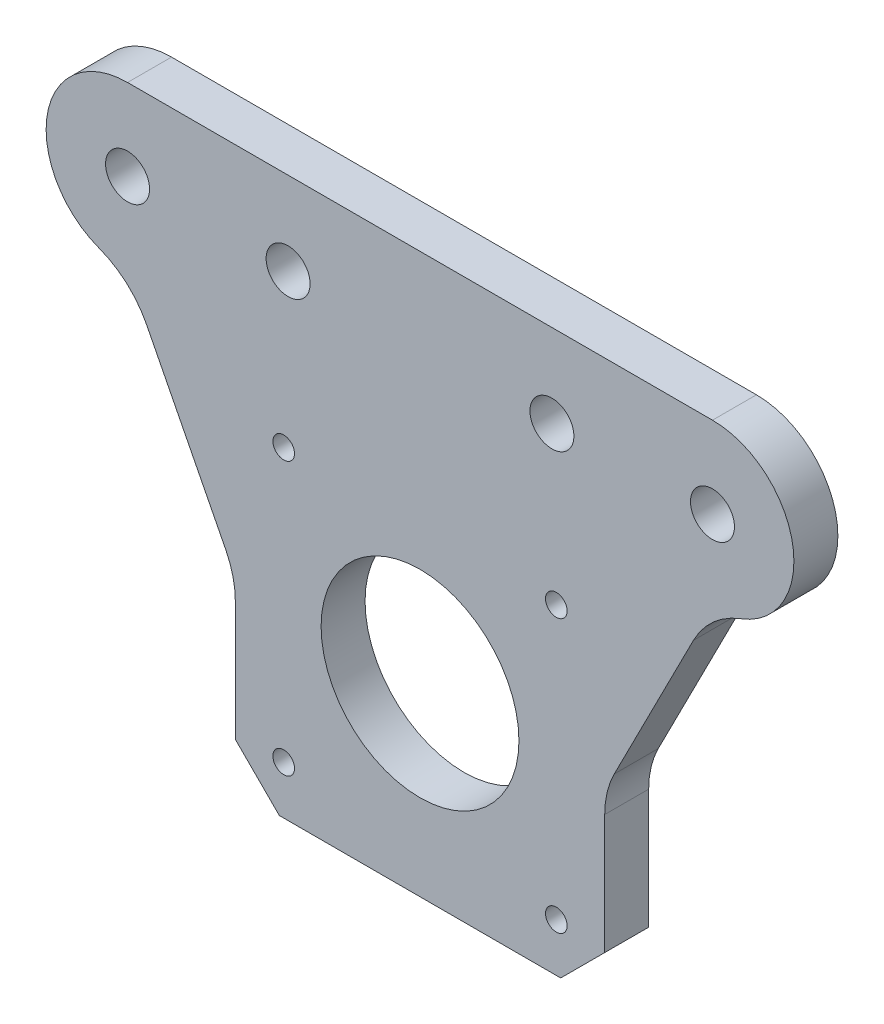
ISO-10303-21;
HEADER;
FILE_DESCRIPTION(('STEP AP214'),'2;1');
FILE_NAME('part.step','',(''),(''),'','','');
FILE_SCHEMA(('AUTOMOTIVE_DESIGN { 1 0 10303 214 1 1 1 1 }'));
ENDSEC;
DATA;
#1=APPLICATION_CONTEXT('core data for automotive mechanical design processes');
#2=APPLICATION_PROTOCOL_DEFINITION('international standard','automotive_design',2000,#1);
#3=PRODUCT_CONTEXT('',#1,'mechanical');
#4=PRODUCT('Part','Part','',(#3));
#5=PRODUCT_RELATED_PRODUCT_CATEGORY('part','',(#4));
#6=PRODUCT_DEFINITION_FORMATION('','',#4);
#7=PRODUCT_DEFINITION_CONTEXT('part definition',#1,'design');
#8=PRODUCT_DEFINITION('design','',#6,#7);
#9=PRODUCT_DEFINITION_SHAPE('','',#8);
#10=(LENGTH_UNIT() NAMED_UNIT(*) SI_UNIT(.MILLI.,.METRE.));
#11=(NAMED_UNIT(*) PLANE_ANGLE_UNIT() SI_UNIT($,.RADIAN.));
#12=(NAMED_UNIT(*) SI_UNIT($,.STERADIAN.) SOLID_ANGLE_UNIT());
#13=UNCERTAINTY_MEASURE_WITH_UNIT(LENGTH_MEASURE(1.E-05),#10,'distance_accuracy_value','');
#14=(GEOMETRIC_REPRESENTATION_CONTEXT(3) GLOBAL_UNCERTAINTY_ASSIGNED_CONTEXT((#13)) GLOBAL_UNIT_ASSIGNED_CONTEXT((#10,
#11,#12)) REPRESENTATION_CONTEXT('',''));
#15=CARTESIAN_POINT('',(0.,0.,0.));
#16=DIRECTION('',(0.,0.,1.));
#17=DIRECTION('',(1.,0.,0.));
#18=AXIS2_PLACEMENT_3D('',#15,#16,#17);
#19=CARTESIAN_POINT('',(-33.2583319181473,33.3054122014625,5.));
#20=DIRECTION('',(0.,0.,1.));
#21=DIRECTION('',(1.,0.,0.));
#22=AXIS2_PLACEMENT_3D('',#19,#20,#21);
#23=PLANE('',#22);
#24=CARTESIAN_POINT('',(0.,0.,5.));
#25=DIRECTION('',(0.,0.,1.));
#26=DIRECTION('',(1.,0.,0.));
#27=AXIS2_PLACEMENT_3D('',#24,#25,#26);
#28=CIRCLE('',#27,11.25);
#29=CARTESIAN_POINT('',(11.25,0.,5.));
#30=VERTEX_POINT('',#29);
#31=EDGE_CURVE('E239',#30,#30,#28,.T.);
#32=ORIENTED_EDGE('',*,*,#31,.F.);
#33=EDGE_LOOP('',(#32));
#34=FACE_BOUND('',#33,.T.);
#35=CARTESIAN_POINT('',(15.5,15.5,5.));
#36=DIRECTION('',(0.,0.,1.));
#37=DIRECTION('',(1.,0.,0.));
#38=AXIS2_PLACEMENT_3D('',#35,#36,#37);
#39=CIRCLE('',#38,1.22949999999999);
#40=CARTESIAN_POINT('',(16.7295,15.5,5.));
#41=VERTEX_POINT('',#40);
#42=EDGE_CURVE('E383',#41,#41,#39,.T.);
#43=ORIENTED_EDGE('',*,*,#42,.F.);
#44=EDGE_LOOP('',(#43));
#45=FACE_BOUND('',#44,.T.);
#46=CARTESIAN_POINT('',(-15.5,-15.5,5.));
#47=DIRECTION('',(0.,0.,1.));
#48=DIRECTION('',(1.,0.,0.));
#49=AXIS2_PLACEMENT_3D('',#46,#47,#48);
#50=CIRCLE('',#49,1.22949999999999);
#51=CARTESIAN_POINT('',(-14.2705,-15.5,5.));
#52=VERTEX_POINT('',#51);
#53=EDGE_CURVE('E376',#52,#52,#50,.T.);
#54=ORIENTED_EDGE('',*,*,#53,.F.);
#55=EDGE_LOOP('',(#54));
#56=FACE_BOUND('',#55,.T.);
#57=CARTESIAN_POINT('',(15.5,-15.5,5.));
#58=DIRECTION('',(0.,0.,1.));
#59=DIRECTION('',(1.,0.,0.));
#60=AXIS2_PLACEMENT_3D('',#57,#58,#59);
#61=CIRCLE('',#60,1.22949999999999);
#62=CARTESIAN_POINT('',(16.7295,-15.5,5.));
#63=VERTEX_POINT('',#62);
#64=EDGE_CURVE('E238',#63,#63,#61,.T.);
#65=ORIENTED_EDGE('',*,*,#64,.F.);
#66=EDGE_LOOP('',(#65));
#67=FACE_BOUND('',#66,.T.);
#68=CARTESIAN_POINT('',(-15.5,15.5,5.));
#69=DIRECTION('',(0.,0.,1.));
#70=DIRECTION('',(1.,0.,0.));
#71=AXIS2_PLACEMENT_3D('',#68,#69,#70);
#72=CIRCLE('',#71,1.22949999999999);
#73=CARTESIAN_POINT('',(-14.2705,15.5,5.));
#74=VERTEX_POINT('',#73);
#75=EDGE_CURVE('E370',#74,#74,#72,.T.);
#76=ORIENTED_EDGE('',*,*,#75,.F.);
#77=EDGE_LOOP('',(#76));
#78=FACE_BOUND('',#77,.T.);
#79=CARTESIAN_POINT('',(-15.,33.1083890078102,5.));
#80=DIRECTION('',(0.,0.,1.));
#81=DIRECTION('',(1.,0.,0.));
#82=AXIS2_PLACEMENT_3D('',#79,#80,#81);
#83=CIRCLE('',#82,2.5);
#84=CARTESIAN_POINT('',(-12.5,33.1083890078102,5.));
#85=VERTEX_POINT('',#84);
#86=EDGE_CURVE('E355',#85,#85,#83,.T.);
#87=ORIENTED_EDGE('',*,*,#86,.F.);
#88=EDGE_LOOP('',(#87));
#89=FACE_BOUND('',#88,.T.);
#90=CARTESIAN_POINT('',(-33.2583319181473,33.3062337538415,5.));
#91=DIRECTION('',(0.,0.,1.));
#92=DIRECTION('',(1.,0.,0.));
#93=AXIS2_PLACEMENT_3D('',#90,#91,#92);
#94=CIRCLE('',#93,2.5);
#95=CARTESIAN_POINT('',(-30.7583319181473,33.3062337538415,5.));
#96=VERTEX_POINT('',#95);
#97=EDGE_CURVE('E180',#96,#96,#94,.T.);
#98=ORIENTED_EDGE('',*,*,#97,.F.);
#99=EDGE_LOOP('',(#98));
#100=FACE_BOUND('',#99,.T.);
#101=DIRECTION('',(1.,0.,0.));
#102=VECTOR('',#101,1.);
#103=CARTESIAN_POINT('',(21.,-21.,5.));
#104=LINE('',#103,#102);
#105=CARTESIAN_POINT('',(-16.,-21.,5.));
#106=VERTEX_POINT('',#105);
#107=CARTESIAN_POINT('',(16.,-21.,5.));
#108=VERTEX_POINT('',#107);
#109=EDGE_CURVE('E175',#106,#108,#104,.T.);
#110=ORIENTED_EDGE('',*,*,#109,.T.);
#111=DIRECTION('',(-0.707106781186549,-0.707106781186546,0.));
#112=VECTOR('',#111,1.);
#113=CARTESIAN_POINT('',(18.5235401416574,-18.4764598583425,5.));
#114=LINE('',#113,#112);
#115=CARTESIAN_POINT('',(21.,-16.,5.));
#116=VERTEX_POINT('',#115);
#117=EDGE_CURVE('E44',#108,#116,#114,.F.);
#118=ORIENTED_EDGE('',*,*,#117,.T.);
#119=DIRECTION('',(0.,1.,0.));
#120=VECTOR('',#119,1.);
#121=CARTESIAN_POINT('',(21.,0.,5.));
#122=LINE('',#121,#120);
#123=CARTESIAN_POINT('',(21.,-2.40189298200222,5.));
#124=VERTEX_POINT('',#123);
#125=EDGE_CURVE('E195',#116,#124,#122,.T.);
#126=ORIENTED_EDGE('',*,*,#125,.T.);
#127=CARTESIAN_POINT('',(31.,-2.40189298200222,5.));
#128=DIRECTION('',(0.,0.,1.));
#129=DIRECTION('',(1.,0.,0.));
#130=AXIS2_PLACEMENT_3D('',#127,#128,#129);
#131=CIRCLE('',#130,10.);
#132=CARTESIAN_POINT('',(22.090883906179,2.13987434215916,5.));
#133=VERTEX_POINT('',#132);
#134=EDGE_CURVE('E216',#124,#133,#131,.F.);
#135=ORIENTED_EDGE('',*,*,#134,.T.);
#136=DIRECTION('',(0.454176732416139,0.890911609382098,0.));
#137=VECTOR('',#136,1.);
#138=CARTESIAN_POINT('',(33.2583319181473,24.0459042440117,5.));
#139=LINE('',#138,#137);
#140=CARTESIAN_POINT('',(31.0983854315652,19.8089602017595,5.));
#141=VERTEX_POINT('',#140);
#142=EDGE_CURVE('E151',#133,#141,#139,.T.);
#143=ORIENTED_EDGE('',*,*,#142,.T.);
#144=CARTESIAN_POINT('',(40.0075015253861,15.2671928775981,5.));
#145=DIRECTION('',(0.,0.,1.));
#146=DIRECTION('',(1.,0.,0.));
#147=AXIS2_PLACEMENT_3D('',#144,#145,#146);
#148=CIRCLE('',#147,10.);
#149=CARTESIAN_POINT('',(36.5031702505948,24.6330704294626,5.));
#150=VERTEX_POINT('',#149);
#151=EDGE_CURVE('E147',#141,#150,#148,.F.);
#152=ORIENTED_EDGE('',*,*,#151,.T.);
#153=CARTESIAN_POINT('',(33.2583319181473,33.3054122014625,5.));
#154=DIRECTION('',(0.,0.,1.));
#155=DIRECTION('',(-1.,0.,0.));
#156=AXIS2_PLACEMENT_3D('',#153,#154,#155);
#157=CIRCLE('',#156,9.25950795745088);
#158=CARTESIAN_POINT('',(33.2583319181473,42.5649201589134,5.));
#159=VERTEX_POINT('',#158);
#160=EDGE_CURVE('E138',#150,#159,#157,.T.);
#161=ORIENTED_EDGE('',*,*,#160,.T.);
#162=DIRECTION('',(-1.,0.,0.));
#163=VECTOR('',#162,1.);
#164=CARTESIAN_POINT('',(-33.2583319181473,42.5649201589134,5.));
#165=LINE('',#164,#163);
#166=CARTESIAN_POINT('',(-33.2583319181473,42.5649201589134,5.));
#167=VERTEX_POINT('',#166);
#168=EDGE_CURVE('E143',#159,#167,#165,.T.);
#169=ORIENTED_EDGE('',*,*,#168,.T.);
#170=CARTESIAN_POINT('',(-33.2583319181473,33.3054122014625,5.));
#171=DIRECTION('',(0.,0.,1.));
#172=DIRECTION('',(1.,0.,0.));
#173=AXIS2_PLACEMENT_3D('',#170,#171,#172);
#174=CIRCLE('',#173,9.25950795745088);
#175=CARTESIAN_POINT('',(-36.5031702505948,24.6330704294625,5.));
#176=VERTEX_POINT('',#175);
#177=EDGE_CURVE('E166',#167,#176,#174,.T.);
#178=ORIENTED_EDGE('',*,*,#177,.T.);
#179=CARTESIAN_POINT('',(-40.0075015253861,15.267192877598,5.));
#180=DIRECTION('',(0.,0.,1.));
#181=DIRECTION('',(1.,0.,0.));
#182=AXIS2_PLACEMENT_3D('',#179,#180,#181);
#183=CIRCLE('',#182,10.);
#184=CARTESIAN_POINT('',(-31.0983854315652,19.8089602017594,5.));
#185=VERTEX_POINT('',#184);
#186=EDGE_CURVE('E229',#176,#185,#183,.F.);
#187=ORIENTED_EDGE('',*,*,#186,.T.);
#188=DIRECTION('',(0.454176732416139,-0.890911609382097,0.));
#189=VECTOR('',#188,1.);
#190=CARTESIAN_POINT('',(-33.2583319181473,24.0459042440117,5.));
#191=LINE('',#190,#189);
#192=CARTESIAN_POINT('',(-22.090883906179,2.13987434215916,5.));
#193=VERTEX_POINT('',#192);
#194=EDGE_CURVE('E168',#185,#193,#191,.T.);
#195=ORIENTED_EDGE('',*,*,#194,.T.);
#196=CARTESIAN_POINT('',(-31.,-2.40189298200223,5.));
#197=DIRECTION('',(0.,0.,1.));
#198=DIRECTION('',(1.,0.,0.));
#199=AXIS2_PLACEMENT_3D('',#196,#197,#198);
#200=CIRCLE('',#199,10.);
#201=CARTESIAN_POINT('',(-21.,-2.40189298200223,5.));
#202=VERTEX_POINT('',#201);
#203=EDGE_CURVE('E211',#193,#202,#200,.F.);
#204=ORIENTED_EDGE('',*,*,#203,.T.);
#205=DIRECTION('',(0.,-1.,0.));
#206=VECTOR('',#205,1.);
#207=CARTESIAN_POINT('',(-21.,0.,5.));
#208=LINE('',#207,#206);
#209=CARTESIAN_POINT('',(-21.,-16.,5.));
#210=VERTEX_POINT('',#209);
#211=EDGE_CURVE('E173',#202,#210,#208,.T.);
#212=ORIENTED_EDGE('',*,*,#211,.T.);
#213=DIRECTION('',(-0.707106781186546,0.707106781186549,0.));
#214=VECTOR('',#213,1.);
#215=CARTESIAN_POINT('',(-51.7818720598049,14.7818720598051,5.));
#216=LINE('',#215,#214);
#217=EDGE_CURVE('E250',#210,#106,#216,.F.);
#218=ORIENTED_EDGE('',*,*,#217,.T.);
#219=EDGE_LOOP('',(#110,#118,#126,#135,#143,#152,#161,#169,#178,#187,#195,#204,#212,#218));
#220=FACE_BOUND('',#219,.T.);
#221=CARTESIAN_POINT('',(33.2583319181473,33.3062337538415,5.));
#222=DIRECTION('',(0.,0.,1.));
#223=DIRECTION('',(-1.,0.,0.));
#224=AXIS2_PLACEMENT_3D('',#221,#222,#223);
#225=CIRCLE('',#224,2.5);
#226=CARTESIAN_POINT('',(30.7583319181473,33.3062337538415,5.));
#227=VERTEX_POINT('',#226);
#228=EDGE_CURVE('E349',#227,#227,#225,.T.);
#229=ORIENTED_EDGE('',*,*,#228,.F.);
#230=EDGE_LOOP('',(#229));
#231=FACE_BOUND('',#230,.T.);
#232=CARTESIAN_POINT('',(15.,33.1083890078102,5.));
#233=DIRECTION('',(0.,0.,1.));
#234=DIRECTION('',(-1.,0.,0.));
#235=AXIS2_PLACEMENT_3D('',#232,#233,#234);
#236=CIRCLE('',#235,2.5);
#237=CARTESIAN_POINT('',(12.5,33.1083890078102,5.));
#238=VERTEX_POINT('',#237);
#239=EDGE_CURVE('E361',#238,#238,#236,.T.);
#240=ORIENTED_EDGE('',*,*,#239,.F.);
#241=EDGE_LOOP('',(#240));
#242=FACE_BOUND('',#241,.T.);
#243=ADVANCED_FACE('F36',(#34,#45,#56,#67,#78,#89,#100,#220,#231,#242),#23,.T.);
#244=CARTESIAN_POINT('',(-33.2583319181473,33.3054122014625,0.));
#245=DIRECTION('',(0.,0.,1.));
#246=DIRECTION('',(1.,0.,0.));
#247=AXIS2_PLACEMENT_3D('',#244,#245,#246);
#248=PLANE('',#247);
#249=CARTESIAN_POINT('',(0.,0.,0.));
#250=DIRECTION('',(0.,0.,1.));
#251=DIRECTION('',(1.,0.,0.));
#252=AXIS2_PLACEMENT_3D('',#249,#250,#251);
#253=CIRCLE('',#252,11.25);
#254=CARTESIAN_POINT('',(11.25,0.,0.));
#255=VERTEX_POINT('',#254);
#256=EDGE_CURVE('E235',#255,#255,#253,.T.);
#257=ORIENTED_EDGE('',*,*,#256,.T.);
#258=EDGE_LOOP('',(#257));
#259=FACE_BOUND('',#258,.T.);
#260=CARTESIAN_POINT('',(15.5,15.5,0.));
#261=DIRECTION('',(0.,0.,1.));
#262=DIRECTION('',(1.,0.,0.));
#263=AXIS2_PLACEMENT_3D('',#260,#261,#262);
#264=CIRCLE('',#263,1.22949999999999);
#265=CARTESIAN_POINT('',(16.7295,15.5,0.));
#266=VERTEX_POINT('',#265);
#267=EDGE_CURVE('E373',#266,#266,#264,.T.);
#268=ORIENTED_EDGE('',*,*,#267,.T.);
#269=EDGE_LOOP('',(#268));
#270=FACE_BOUND('',#269,.T.);
#271=CARTESIAN_POINT('',(-15.5,-15.5,0.));
#272=DIRECTION('',(0.,0.,1.));
#273=DIRECTION('',(1.,0.,0.));
#274=AXIS2_PLACEMENT_3D('',#271,#272,#273);
#275=CIRCLE('',#274,1.22949999999999);
#276=CARTESIAN_POINT('',(-14.2705,-15.5,0.));
#277=VERTEX_POINT('',#276);
#278=EDGE_CURVE('E379',#277,#277,#275,.T.);
#279=ORIENTED_EDGE('',*,*,#278,.T.);
#280=EDGE_LOOP('',(#279));
#281=FACE_BOUND('',#280,.T.);
#282=CARTESIAN_POINT('',(15.5,-15.5,0.));
#283=DIRECTION('',(0.,0.,1.));
#284=DIRECTION('',(1.,0.,0.));
#285=AXIS2_PLACEMENT_3D('',#282,#283,#284);
#286=CIRCLE('',#285,1.22949999999999);
#287=CARTESIAN_POINT('',(16.7295,-15.5,0.));
#288=VERTEX_POINT('',#287);
#289=EDGE_CURVE('E380',#288,#288,#286,.T.);
#290=ORIENTED_EDGE('',*,*,#289,.T.);
#291=EDGE_LOOP('',(#290));
#292=FACE_BOUND('',#291,.T.);
#293=CARTESIAN_POINT('',(-15.5,15.5,0.));
#294=DIRECTION('',(0.,0.,1.));
#295=DIRECTION('',(1.,0.,0.));
#296=AXIS2_PLACEMENT_3D('',#293,#294,#295);
#297=CIRCLE('',#296,1.22949999999999);
#298=CARTESIAN_POINT('',(-14.2705,15.5,0.));
#299=VERTEX_POINT('',#298);
#300=EDGE_CURVE('E367',#299,#299,#297,.T.);
#301=ORIENTED_EDGE('',*,*,#300,.T.);
#302=EDGE_LOOP('',(#301));
#303=FACE_BOUND('',#302,.T.);
#304=DIRECTION('',(0.,1.,0.));
#305=VECTOR('',#304,1.);
#306=CARTESIAN_POINT('',(21.,0.,0.));
#307=LINE('',#306,#305);
#308=CARTESIAN_POINT('',(21.,-16.,0.));
#309=VERTEX_POINT('',#308);
#310=CARTESIAN_POINT('',(21.,-2.40189298200222,0.));
#311=VERTEX_POINT('',#310);
#312=EDGE_CURVE('E177',#309,#311,#307,.T.);
#313=ORIENTED_EDGE('',*,*,#312,.F.);
#314=DIRECTION('',(0.707106781186549,0.707106781186546,0.));
#315=VECTOR('',#314,1.);
#316=CARTESIAN_POINT('',(21.,-16.,0.));
#317=LINE('',#316,#315);
#318=CARTESIAN_POINT('',(16.,-21.,0.));
#319=VERTEX_POINT('',#318);
#320=EDGE_CURVE('E244',#309,#319,#317,.F.);
#321=ORIENTED_EDGE('',*,*,#320,.T.);
#322=DIRECTION('',(1.,0.,0.));
#323=VECTOR('',#322,1.);
#324=CARTESIAN_POINT('',(21.,-21.,0.));
#325=LINE('',#324,#323);
#326=CARTESIAN_POINT('',(-16.,-21.,0.));
#327=VERTEX_POINT('',#326);
#328=EDGE_CURVE('E193',#327,#319,#325,.T.);
#329=ORIENTED_EDGE('',*,*,#328,.F.);
#330=DIRECTION('',(0.707106781186546,-0.707106781186549,0.));
#331=VECTOR('',#330,1.);
#332=CARTESIAN_POINT('',(-16.,-21.,0.));
#333=LINE('',#332,#331);
#334=CARTESIAN_POINT('',(-21.,-16.,0.));
#335=VERTEX_POINT('',#334);
#336=EDGE_CURVE('E242',#327,#335,#333,.F.);
#337=ORIENTED_EDGE('',*,*,#336,.T.);
#338=DIRECTION('',(0.,-1.,0.));
#339=VECTOR('',#338,1.);
#340=CARTESIAN_POINT('',(-21.,0.,0.));
#341=LINE('',#340,#339);
#342=CARTESIAN_POINT('',(-21.,-2.40189298200223,0.));
#343=VERTEX_POINT('',#342);
#344=EDGE_CURVE('E191',#343,#335,#341,.T.);
#345=ORIENTED_EDGE('',*,*,#344,.F.);
#346=CARTESIAN_POINT('',(-31.,-2.40189298200223,0.));
#347=DIRECTION('',(0.,0.,1.));
#348=DIRECTION('',(1.,0.,0.));
#349=AXIS2_PLACEMENT_3D('',#346,#347,#348);
#350=CIRCLE('',#349,10.);
#351=CARTESIAN_POINT('',(-22.090883906179,2.13987434215916,0.));
#352=VERTEX_POINT('',#351);
#353=EDGE_CURVE('E208',#343,#352,#350,.T.);
#354=ORIENTED_EDGE('',*,*,#353,.T.);
#355=DIRECTION('',(0.454176732416139,-0.890911609382097,0.));
#356=VECTOR('',#355,1.);
#357=CARTESIAN_POINT('',(-33.2583319181473,24.0459042440117,0.));
#358=LINE('',#357,#356);
#359=CARTESIAN_POINT('',(-31.0983854315652,19.8089602017594,0.));
#360=VERTEX_POINT('',#359);
#361=EDGE_CURVE('E189',#360,#352,#358,.T.);
#362=ORIENTED_EDGE('',*,*,#361,.F.);
#363=CARTESIAN_POINT('',(-40.0075015253861,15.267192877598,0.));
#364=DIRECTION('',(0.,0.,1.));
#365=DIRECTION('',(1.,0.,0.));
#366=AXIS2_PLACEMENT_3D('',#363,#364,#365);
#367=CIRCLE('',#366,10.);
#368=CARTESIAN_POINT('',(-36.5031702505948,24.6330704294625,0.));
#369=VERTEX_POINT('',#368);
#370=EDGE_CURVE('E227',#360,#369,#367,.T.);
#371=ORIENTED_EDGE('',*,*,#370,.T.);
#372=CARTESIAN_POINT('',(-33.2583319181473,33.3054122014625,0.));
#373=DIRECTION('',(0.,0.,1.));
#374=DIRECTION('',(1.,0.,0.));
#375=AXIS2_PLACEMENT_3D('',#372,#373,#374);
#376=CIRCLE('',#375,9.25950795745088);
#377=CARTESIAN_POINT('',(-33.2583319181473,42.5649201589134,0.));
#378=VERTEX_POINT('',#377);
#379=EDGE_CURVE('E186',#378,#369,#376,.T.);
#380=ORIENTED_EDGE('',*,*,#379,.F.);
#381=DIRECTION('',(-1.,0.,0.));
#382=VECTOR('',#381,1.);
#383=CARTESIAN_POINT('',(-33.2583319181473,42.5649201589134,0.));
#384=LINE('',#383,#382);
#385=CARTESIAN_POINT('',(33.2583319181473,42.5649201589134,0.));
#386=VERTEX_POINT('',#385);
#387=EDGE_CURVE('E184',#386,#378,#384,.T.);
#388=ORIENTED_EDGE('',*,*,#387,.F.);
#389=CARTESIAN_POINT('',(33.2583319181473,33.3054122014625,0.));
#390=DIRECTION('',(0.,0.,1.));
#391=DIRECTION('',(-1.,0.,0.));
#392=AXIS2_PLACEMENT_3D('',#389,#390,#391);
#393=CIRCLE('',#392,9.25950795745088);
#394=CARTESIAN_POINT('',(36.5031702505948,24.6330704294626,0.));
#395=VERTEX_POINT('',#394);
#396=EDGE_CURVE('E157',#395,#386,#393,.T.);
#397=ORIENTED_EDGE('',*,*,#396,.F.);
#398=CARTESIAN_POINT('',(40.0075015253861,15.2671928775981,0.));
#399=DIRECTION('',(0.,0.,1.));
#400=DIRECTION('',(1.,0.,0.));
#401=AXIS2_PLACEMENT_3D('',#398,#399,#400);
#402=CIRCLE('',#401,10.);
#403=CARTESIAN_POINT('',(31.0983854315652,19.8089602017595,0.));
#404=VERTEX_POINT('',#403);
#405=EDGE_CURVE('E231',#395,#404,#402,.T.);
#406=ORIENTED_EDGE('',*,*,#405,.T.);
#407=DIRECTION('',(0.454176732416139,0.890911609382098,0.));
#408=VECTOR('',#407,1.);
#409=CARTESIAN_POINT('',(33.2583319181473,24.0459042440117,0.));
#410=LINE('',#409,#408);
#411=CARTESIAN_POINT('',(22.090883906179,2.13987434215916,0.));
#412=VERTEX_POINT('',#411);
#413=EDGE_CURVE('E179',#412,#404,#410,.T.);
#414=ORIENTED_EDGE('',*,*,#413,.F.);
#415=CARTESIAN_POINT('',(31.,-2.40189298200222,0.));
#416=DIRECTION('',(0.,0.,1.));
#417=DIRECTION('',(1.,0.,0.));
#418=AXIS2_PLACEMENT_3D('',#415,#416,#417);
#419=CIRCLE('',#418,10.);
#420=EDGE_CURVE('E213',#412,#311,#419,.T.);
#421=ORIENTED_EDGE('',*,*,#420,.T.);
#422=EDGE_LOOP('',(#313,#321,#329,#337,#345,#354,#362,#371,#380,#388,#397,#406,#414,#421));
#423=FACE_BOUND('',#422,.T.);
#424=CARTESIAN_POINT('',(-33.2583319181473,33.3062337538415,0.));
#425=DIRECTION('',(0.,0.,1.));
#426=DIRECTION('',(1.,0.,0.));
#427=AXIS2_PLACEMENT_3D('',#424,#425,#426);
#428=CIRCLE('',#427,2.5);
#429=CARTESIAN_POINT('',(-30.7583319181473,33.3062337538415,0.));
#430=VERTEX_POINT('',#429);
#431=EDGE_CURVE('E346',#430,#430,#428,.T.);
#432=ORIENTED_EDGE('',*,*,#431,.T.);
#433=EDGE_LOOP('',(#432));
#434=FACE_BOUND('',#433,.T.);
#435=CARTESIAN_POINT('',(33.2583319181473,33.3062337538415,0.));
#436=DIRECTION('',(0.,0.,1.));
#437=DIRECTION('',(-1.,0.,0.));
#438=AXIS2_PLACEMENT_3D('',#435,#436,#437);
#439=CIRCLE('',#438,2.5);
#440=CARTESIAN_POINT('',(30.7583319181473,33.3062337538415,0.));
#441=VERTEX_POINT('',#440);
#442=EDGE_CURVE('E352',#441,#441,#439,.T.);
#443=ORIENTED_EDGE('',*,*,#442,.T.);
#444=EDGE_LOOP('',(#443));
#445=FACE_BOUND('',#444,.T.);
#446=CARTESIAN_POINT('',(-15.,33.1083890078102,0.));
#447=DIRECTION('',(0.,0.,1.));
#448=DIRECTION('',(1.,0.,0.));
#449=AXIS2_PLACEMENT_3D('',#446,#447,#448);
#450=CIRCLE('',#449,2.5);
#451=CARTESIAN_POINT('',(-12.5,33.1083890078102,0.));
#452=VERTEX_POINT('',#451);
#453=EDGE_CURVE('E358',#452,#452,#450,.T.);
#454=ORIENTED_EDGE('',*,*,#453,.T.);
#455=EDGE_LOOP('',(#454));
#456=FACE_BOUND('',#455,.T.);
#457=CARTESIAN_POINT('',(15.,33.1083890078102,0.));
#458=DIRECTION('',(0.,0.,1.));
#459=DIRECTION('',(-1.,0.,0.));
#460=AXIS2_PLACEMENT_3D('',#457,#458,#459);
#461=CIRCLE('',#460,2.5);
#462=CARTESIAN_POINT('',(12.5,33.1083890078102,0.));
#463=VERTEX_POINT('',#462);
#464=EDGE_CURVE('E364',#463,#463,#461,.T.);
#465=ORIENTED_EDGE('',*,*,#464,.T.);
#466=EDGE_LOOP('',(#465));
#467=FACE_BOUND('',#466,.T.);
#468=ADVANCED_FACE('F264',(#259,#270,#281,#292,#303,#423,#434,#445,#456,#467),#248,.F.);
#469=CARTESIAN_POINT('',(21.,0.,5.));
#470=DIRECTION('',(-1.,0.,0.));
#471=DIRECTION('',(0.,0.,1.));
#472=AXIS2_PLACEMENT_3D('',#469,#470,#471);
#473=PLANE('',#472);
#474=ORIENTED_EDGE('',*,*,#125,.F.);
#475=DIRECTION('',(0.,0.,-1.));
#476=VECTOR('',#475,1.);
#477=CARTESIAN_POINT('',(21.,-16.,5.));
#478=LINE('',#477,#476);
#479=EDGE_CURVE('E234',#116,#309,#478,.T.);
#480=ORIENTED_EDGE('',*,*,#479,.T.);
#481=ORIENTED_EDGE('',*,*,#312,.T.);
#482=DIRECTION('',(0.,0.,-1.));
#483=VECTOR('',#482,1.);
#484=CARTESIAN_POINT('',(21.,-2.40189298200222,5.));
#485=LINE('',#484,#483);
#486=EDGE_CURVE('E205',#311,#124,#485,.F.);
#487=ORIENTED_EDGE('',*,*,#486,.T.);
#488=EDGE_LOOP('',(#474,#480,#481,#487));
#489=FACE_BOUND('',#488,.T.);
#490=ADVANCED_FACE('F256',(#489),#473,.F.);
#491=CARTESIAN_POINT('',(33.2583319181473,24.0459042440117,5.));
#492=DIRECTION('',(-0.890911609382098,0.454176732416139,0.));
#493=DIRECTION('',(-0.454176732416139,-0.890911609382098,0.));
#494=AXIS2_PLACEMENT_3D('',#491,#492,#493);
#495=PLANE('',#494);
#496=ORIENTED_EDGE('',*,*,#413,.T.);
#497=DIRECTION('',(0.,0.,1.));
#498=VECTOR('',#497,1.);
#499=CARTESIAN_POINT('',(31.0983854315652,19.8089602017595,5.));
#500=LINE('',#499,#498);
#501=EDGE_CURVE('E225',#404,#141,#500,.T.);
#502=ORIENTED_EDGE('',*,*,#501,.T.);
#503=ORIENTED_EDGE('',*,*,#142,.F.);
#504=DIRECTION('',(0.,0.,-1.));
#505=VECTOR('',#504,1.);
#506=CARTESIAN_POINT('',(22.090883906179,2.13987434215917,0.));
#507=LINE('',#506,#505);
#508=EDGE_CURVE('E202',#133,#412,#507,.T.);
#509=ORIENTED_EDGE('',*,*,#508,.T.);
#510=EDGE_LOOP('',(#496,#502,#503,#509));
#511=FACE_BOUND('',#510,.T.);
#512=ADVANCED_FACE('F293',(#511),#495,.F.);
#513=CARTESIAN_POINT('',(33.2583319181473,33.3054122014625,5.));
#514=DIRECTION('',(0.,0.,-1.));
#515=DIRECTION('',(-1.,0.,0.));
#516=AXIS2_PLACEMENT_3D('',#513,#514,#515);
#517=CYLINDRICAL_SURFACE('',#516,9.25950795745088);
#518=ORIENTED_EDGE('',*,*,#160,.F.);
#519=DIRECTION('',(0.,0.,-1.));
#520=VECTOR('',#519,1.);
#521=CARTESIAN_POINT('',(36.5031702505948,24.6330704294626,5.));
#522=LINE('',#521,#520);
#523=EDGE_CURVE('E223',#150,#395,#522,.T.);
#524=ORIENTED_EDGE('',*,*,#523,.T.);
#525=ORIENTED_EDGE('',*,*,#396,.T.);
#526=DIRECTION('',(0.,0.,-1.));
#527=VECTOR('',#526,1.);
#528=CARTESIAN_POINT('',(33.2583319181473,42.5649201589134,5.));
#529=LINE('',#528,#527);
#530=EDGE_CURVE('E154',#159,#386,#529,.T.);
#531=ORIENTED_EDGE('',*,*,#530,.F.);
#532=EDGE_LOOP('',(#518,#524,#525,#531));
#533=FACE_BOUND('',#532,.T.);
#534=ADVANCED_FACE('F155',(#533),#517,.T.);
#535=CARTESIAN_POINT('',(-33.2583319181473,42.5649201589134,5.));
#536=DIRECTION('',(0.,-1.,0.));
#537=DIRECTION('',(0.,0.,-1.));
#538=AXIS2_PLACEMENT_3D('',#535,#536,#537);
#539=PLANE('',#538);
#540=ORIENTED_EDGE('',*,*,#387,.T.);
#541=DIRECTION('',(0.,0.,-1.));
#542=VECTOR('',#541,1.);
#543=CARTESIAN_POINT('',(-33.2583319181473,42.5649201589134,5.));
#544=LINE('',#543,#542);
#545=EDGE_CURVE('E161',#167,#378,#544,.T.);
#546=ORIENTED_EDGE('',*,*,#545,.F.);
#547=ORIENTED_EDGE('',*,*,#168,.F.);
#548=ORIENTED_EDGE('',*,*,#530,.T.);
#549=EDGE_LOOP('',(#540,#546,#547,#548));
#550=FACE_BOUND('',#549,.T.);
#551=ADVANCED_FACE('F163',(#550),#539,.F.);
#552=CARTESIAN_POINT('',(-33.2583319181473,33.3054122014625,5.));
#553=DIRECTION('',(0.,0.,-1.));
#554=DIRECTION('',(-1.,0.,0.));
#555=AXIS2_PLACEMENT_3D('',#552,#553,#554);
#556=CYLINDRICAL_SURFACE('',#555,9.25950795745088);
#557=ORIENTED_EDGE('',*,*,#379,.T.);
#558=DIRECTION('',(0.,0.,-1.));
#559=VECTOR('',#558,1.);
#560=CARTESIAN_POINT('',(-36.5031702505948,24.6330704294625,5.));
#561=LINE('',#560,#559);
#562=EDGE_CURVE('E221',#369,#176,#561,.F.);
#563=ORIENTED_EDGE('',*,*,#562,.T.);
#564=ORIENTED_EDGE('',*,*,#177,.F.);
#565=ORIENTED_EDGE('',*,*,#545,.T.);
#566=EDGE_LOOP('',(#557,#563,#564,#565));
#567=FACE_BOUND('',#566,.T.);
#568=ADVANCED_FACE('F288',(#567),#556,.T.);
#569=CARTESIAN_POINT('',(-33.2583319181473,24.0459042440117,5.));
#570=DIRECTION('',(0.890911609382097,0.454176732416139,0.));
#571=DIRECTION('',(-0.454176732416139,0.890911609382098,0.));
#572=AXIS2_PLACEMENT_3D('',#569,#570,#571);
#573=PLANE('',#572);
#574=ORIENTED_EDGE('',*,*,#194,.F.);
#575=DIRECTION('',(0.,0.,1.));
#576=VECTOR('',#575,1.);
#577=CARTESIAN_POINT('',(-31.0983854315652,19.8089602017594,0.));
#578=LINE('',#577,#576);
#579=EDGE_CURVE('E218',#185,#360,#578,.F.);
#580=ORIENTED_EDGE('',*,*,#579,.T.);
#581=ORIENTED_EDGE('',*,*,#361,.T.);
#582=DIRECTION('',(0.,0.,-1.));
#583=VECTOR('',#582,1.);
#584=CARTESIAN_POINT('',(-22.090883906179,2.13987434215916,5.));
#585=LINE('',#584,#583);
#586=EDGE_CURVE('E199',#352,#193,#585,.F.);
#587=ORIENTED_EDGE('',*,*,#586,.T.);
#588=EDGE_LOOP('',(#574,#580,#581,#587));
#589=FACE_BOUND('',#588,.T.);
#590=ADVANCED_FACE('F281',(#589),#573,.F.);
#591=CARTESIAN_POINT('',(-21.,0.,5.));
#592=DIRECTION('',(1.,0.,0.));
#593=DIRECTION('',(0.,0.,-1.));
#594=AXIS2_PLACEMENT_3D('',#591,#592,#593);
#595=PLANE('',#594);
#596=ORIENTED_EDGE('',*,*,#344,.T.);
#597=DIRECTION('',(0.,0.,1.));
#598=VECTOR('',#597,1.);
#599=CARTESIAN_POINT('',(-21.,-16.,5.));
#600=LINE('',#599,#598);
#601=EDGE_CURVE('E11',#335,#210,#600,.T.);
#602=ORIENTED_EDGE('',*,*,#601,.T.);
#603=ORIENTED_EDGE('',*,*,#211,.F.);
#604=DIRECTION('',(0.,0.,-1.));
#605=VECTOR('',#604,1.);
#606=CARTESIAN_POINT('',(-21.,-2.40189298200223,0.));
#607=LINE('',#606,#605);
#608=EDGE_CURVE('E160',#202,#343,#607,.T.);
#609=ORIENTED_EDGE('',*,*,#608,.T.);
#610=EDGE_LOOP('',(#596,#602,#603,#609));
#611=FACE_BOUND('',#610,.T.);
#612=ADVANCED_FACE('F271',(#611),#595,.F.);
#613=CARTESIAN_POINT('',(21.,-21.,5.));
#614=DIRECTION('',(0.,1.,0.));
#615=DIRECTION('',(0.,0.,1.));
#616=AXIS2_PLACEMENT_3D('',#613,#614,#615);
#617=PLANE('',#616);
#618=ORIENTED_EDGE('',*,*,#328,.T.);
#619=DIRECTION('',(0.,0.,1.));
#620=VECTOR('',#619,1.);
#621=CARTESIAN_POINT('',(16.,-21.,5.));
#622=LINE('',#621,#620);
#623=EDGE_CURVE('E57',#319,#108,#622,.T.);
#624=ORIENTED_EDGE('',*,*,#623,.T.);
#625=ORIENTED_EDGE('',*,*,#109,.F.);
#626=DIRECTION('',(0.,0.,-1.));
#627=VECTOR('',#626,1.);
#628=CARTESIAN_POINT('',(-16.,-21.,5.));
#629=LINE('',#628,#627);
#630=EDGE_CURVE('E246',#106,#327,#629,.T.);
#631=ORIENTED_EDGE('',*,*,#630,.T.);
#632=EDGE_LOOP('',(#618,#624,#625,#631));
#633=FACE_BOUND('',#632,.T.);
#634=ADVANCED_FACE('F266',(#633),#617,.F.);
#635=CARTESIAN_POINT('',(-33.2583319181473,33.3062337538415,5.));
#636=DIRECTION('',(0.,0.,-1.));
#637=DIRECTION('',(-1.,0.,0.));
#638=AXIS2_PLACEMENT_3D('',#635,#636,#637);
#639=CYLINDRICAL_SURFACE('',#638,2.5);
#640=ORIENTED_EDGE('',*,*,#97,.T.);
#641=EDGE_LOOP('',(#640));
#642=FACE_BOUND('',#641,.T.);
#643=ORIENTED_EDGE('',*,*,#431,.F.);
#644=EDGE_LOOP('',(#643));
#645=FACE_BOUND('',#644,.T.);
#646=ADVANCED_FACE('F319',(#642,#645),#639,.F.);
#647=CARTESIAN_POINT('',(33.2583319181473,33.3062337538415,5.));
#648=DIRECTION('',(0.,0.,-1.));
#649=DIRECTION('',(-1.,0.,0.));
#650=AXIS2_PLACEMENT_3D('',#647,#648,#649);
#651=CYLINDRICAL_SURFACE('',#650,2.5);
#652=ORIENTED_EDGE('',*,*,#228,.T.);
#653=EDGE_LOOP('',(#652));
#654=FACE_BOUND('',#653,.T.);
#655=ORIENTED_EDGE('',*,*,#442,.F.);
#656=EDGE_LOOP('',(#655));
#657=FACE_BOUND('',#656,.T.);
#658=ADVANCED_FACE('F419',(#654,#657),#651,.F.);
#659=CARTESIAN_POINT('',(-15.,33.1083890078102,5.));
#660=DIRECTION('',(0.,0.,-1.));
#661=DIRECTION('',(-1.,0.,0.));
#662=AXIS2_PLACEMENT_3D('',#659,#660,#661);
#663=CYLINDRICAL_SURFACE('',#662,2.5);
#664=ORIENTED_EDGE('',*,*,#86,.T.);
#665=EDGE_LOOP('',(#664));
#666=FACE_BOUND('',#665,.T.);
#667=ORIENTED_EDGE('',*,*,#453,.F.);
#668=EDGE_LOOP('',(#667));
#669=FACE_BOUND('',#668,.T.);
#670=ADVANCED_FACE('F429',(#666,#669),#663,.F.);
#671=CARTESIAN_POINT('',(15.,33.1083890078102,5.));
#672=DIRECTION('',(0.,0.,-1.));
#673=DIRECTION('',(-1.,0.,0.));
#674=AXIS2_PLACEMENT_3D('',#671,#672,#673);
#675=CYLINDRICAL_SURFACE('',#674,2.5);
#676=ORIENTED_EDGE('',*,*,#239,.T.);
#677=EDGE_LOOP('',(#676));
#678=FACE_BOUND('',#677,.T.);
#679=ORIENTED_EDGE('',*,*,#464,.F.);
#680=EDGE_LOOP('',(#679));
#681=FACE_BOUND('',#680,.T.);
#682=ADVANCED_FACE('F408',(#678,#681),#675,.F.);
#683=CARTESIAN_POINT('',(-15.5,15.5,0.));
#684=DIRECTION('',(0.,0.,1.));
#685=DIRECTION('',(1.,0.,0.));
#686=AXIS2_PLACEMENT_3D('',#683,#684,#685);
#687=CYLINDRICAL_SURFACE('',#686,1.22949999999999);
#688=ORIENTED_EDGE('',*,*,#300,.F.);
#689=EDGE_LOOP('',(#688));
#690=FACE_BOUND('',#689,.T.);
#691=ORIENTED_EDGE('',*,*,#75,.T.);
#692=EDGE_LOOP('',(#691));
#693=FACE_BOUND('',#692,.T.);
#694=ADVANCED_FACE('F404',(#690,#693),#687,.F.);
#695=CARTESIAN_POINT('',(15.5,-15.5,0.));
#696=DIRECTION('',(0.,0.,1.));
#697=DIRECTION('',(1.,0.,0.));
#698=AXIS2_PLACEMENT_3D('',#695,#696,#697);
#699=CYLINDRICAL_SURFACE('',#698,1.22949999999999);
#700=ORIENTED_EDGE('',*,*,#289,.F.);
#701=EDGE_LOOP('',(#700));
#702=FACE_BOUND('',#701,.T.);
#703=ORIENTED_EDGE('',*,*,#64,.T.);
#704=EDGE_LOOP('',(#703));
#705=FACE_BOUND('',#704,.T.);
#706=ADVANCED_FACE('F407',(#702,#705),#699,.F.);
#707=CARTESIAN_POINT('',(-15.5,-15.5,0.));
#708=DIRECTION('',(0.,0.,1.));
#709=DIRECTION('',(1.,0.,0.));
#710=AXIS2_PLACEMENT_3D('',#707,#708,#709);
#711=CYLINDRICAL_SURFACE('',#710,1.22949999999999);
#712=ORIENTED_EDGE('',*,*,#278,.F.);
#713=EDGE_LOOP('',(#712));
#714=FACE_BOUND('',#713,.T.);
#715=ORIENTED_EDGE('',*,*,#53,.T.);
#716=EDGE_LOOP('',(#715));
#717=FACE_BOUND('',#716,.T.);
#718=ADVANCED_FACE('F471',(#714,#717),#711,.F.);
#719=CARTESIAN_POINT('',(15.5,15.5,0.));
#720=DIRECTION('',(0.,0.,1.));
#721=DIRECTION('',(1.,0.,0.));
#722=AXIS2_PLACEMENT_3D('',#719,#720,#721);
#723=CYLINDRICAL_SURFACE('',#722,1.22949999999999);
#724=ORIENTED_EDGE('',*,*,#267,.F.);
#725=EDGE_LOOP('',(#724));
#726=FACE_BOUND('',#725,.T.);
#727=ORIENTED_EDGE('',*,*,#42,.T.);
#728=EDGE_LOOP('',(#727));
#729=FACE_BOUND('',#728,.T.);
#730=ADVANCED_FACE('F340',(#726,#729),#723,.F.);
#731=CARTESIAN_POINT('',(-31.,-2.40189298200223,5.));
#732=DIRECTION('',(0.,0.,1.));
#733=DIRECTION('',(1.,0.,0.));
#734=AXIS2_PLACEMENT_3D('',#731,#732,#733);
#735=CYLINDRICAL_SURFACE('',#734,10.);
#736=ORIENTED_EDGE('',*,*,#203,.F.);
#737=ORIENTED_EDGE('',*,*,#586,.F.);
#738=ORIENTED_EDGE('',*,*,#353,.F.);
#739=ORIENTED_EDGE('',*,*,#608,.F.);
#740=EDGE_LOOP('',(#736,#737,#738,#739));
#741=FACE_BOUND('',#740,.T.);
#742=ADVANCED_FACE('F275',(#741),#735,.F.);
#743=CARTESIAN_POINT('',(31.,-2.40189298200222,5.));
#744=DIRECTION('',(0.,0.,1.));
#745=DIRECTION('',(1.,0.,0.));
#746=AXIS2_PLACEMENT_3D('',#743,#744,#745);
#747=CYLINDRICAL_SURFACE('',#746,10.);
#748=ORIENTED_EDGE('',*,*,#134,.F.);
#749=ORIENTED_EDGE('',*,*,#486,.F.);
#750=ORIENTED_EDGE('',*,*,#420,.F.);
#751=ORIENTED_EDGE('',*,*,#508,.F.);
#752=EDGE_LOOP('',(#748,#749,#750,#751));
#753=FACE_BOUND('',#752,.T.);
#754=ADVANCED_FACE('F306',(#753),#747,.F.);
#755=CARTESIAN_POINT('',(-40.0075015253861,15.267192877598,5.));
#756=DIRECTION('',(0.,0.,-1.));
#757=DIRECTION('',(-1.,0.,0.));
#758=AXIS2_PLACEMENT_3D('',#755,#756,#757);
#759=CYLINDRICAL_SURFACE('',#758,10.);
#760=ORIENTED_EDGE('',*,*,#186,.F.);
#761=ORIENTED_EDGE('',*,*,#562,.F.);
#762=ORIENTED_EDGE('',*,*,#370,.F.);
#763=ORIENTED_EDGE('',*,*,#579,.F.);
#764=EDGE_LOOP('',(#760,#761,#762,#763));
#765=FACE_BOUND('',#764,.T.);
#766=ADVANCED_FACE('F285',(#765),#759,.F.);
#767=CARTESIAN_POINT('',(40.0075015253861,15.2671928775981,5.));
#768=DIRECTION('',(0.,0.,-1.));
#769=DIRECTION('',(-1.,0.,0.));
#770=AXIS2_PLACEMENT_3D('',#767,#768,#769);
#771=CYLINDRICAL_SURFACE('',#770,10.);
#772=ORIENTED_EDGE('',*,*,#151,.F.);
#773=ORIENTED_EDGE('',*,*,#501,.F.);
#774=ORIENTED_EDGE('',*,*,#405,.F.);
#775=ORIENTED_EDGE('',*,*,#523,.F.);
#776=EDGE_LOOP('',(#772,#773,#774,#775));
#777=FACE_BOUND('',#776,.T.);
#778=ADVANCED_FACE('F296',(#777),#771,.F.);
#779=CARTESIAN_POINT('',(0.,0.,-5.));
#780=DIRECTION('',(0.,0.,1.));
#781=DIRECTION('',(1.,0.,0.));
#782=AXIS2_PLACEMENT_3D('',#779,#780,#781);
#783=CYLINDRICAL_SURFACE('',#782,11.25);
#784=ORIENTED_EDGE('',*,*,#31,.T.);
#785=EDGE_LOOP('',(#784));
#786=FACE_BOUND('',#785,.T.);
#787=ORIENTED_EDGE('',*,*,#256,.F.);
#788=EDGE_LOOP('',(#787));
#789=FACE_BOUND('',#788,.T.);
#790=ADVANCED_FACE('F298',(#786,#789),#783,.F.);
#791=CARTESIAN_POINT('',(21.,-16.,5.));
#792=DIRECTION('',(-0.707106781186545,0.707106781186549,0.));
#793=DIRECTION('',(0.,0.,-1.));
#794=AXIS2_PLACEMENT_3D('',#791,#792,#793);
#795=PLANE('',#794);
#796=ORIENTED_EDGE('',*,*,#117,.F.);
#797=ORIENTED_EDGE('',*,*,#623,.F.);
#798=ORIENTED_EDGE('',*,*,#320,.F.);
#799=ORIENTED_EDGE('',*,*,#479,.F.);
#800=EDGE_LOOP('',(#796,#797,#798,#799));
#801=FACE_BOUND('',#800,.T.);
#802=ADVANCED_FACE('F261',(#801),#795,.F.);
#803=CARTESIAN_POINT('',(-16.,-21.,5.));
#804=DIRECTION('',(0.707106781186549,0.707106781186545,0.));
#805=DIRECTION('',(0.,0.,-1.));
#806=AXIS2_PLACEMENT_3D('',#803,#804,#805);
#807=PLANE('',#806);
#808=ORIENTED_EDGE('',*,*,#217,.F.);
#809=ORIENTED_EDGE('',*,*,#601,.F.);
#810=ORIENTED_EDGE('',*,*,#336,.F.);
#811=ORIENTED_EDGE('',*,*,#630,.F.);
#812=EDGE_LOOP('',(#808,#809,#810,#811));
#813=FACE_BOUND('',#812,.T.);
#814=ADVANCED_FACE('F38',(#813),#807,.F.);
#815=CLOSED_SHELL('',(#243,#468,#490,#512,#534,#551,#568,#590,#612,#634,#646,#658,#670,#682,
#694,#706,#718,#730,#742,#754,#766,#778,#790,#802,#814));
#816=MANIFOLD_SOLID_BREP('B2',#815);
#817=ADVANCED_BREP_SHAPE_REPRESENTATION('',(#18,#816),#14);
#818=SHAPE_DEFINITION_REPRESENTATION(#9,#817);
ENDSEC;
END-ISO-10303-21;
